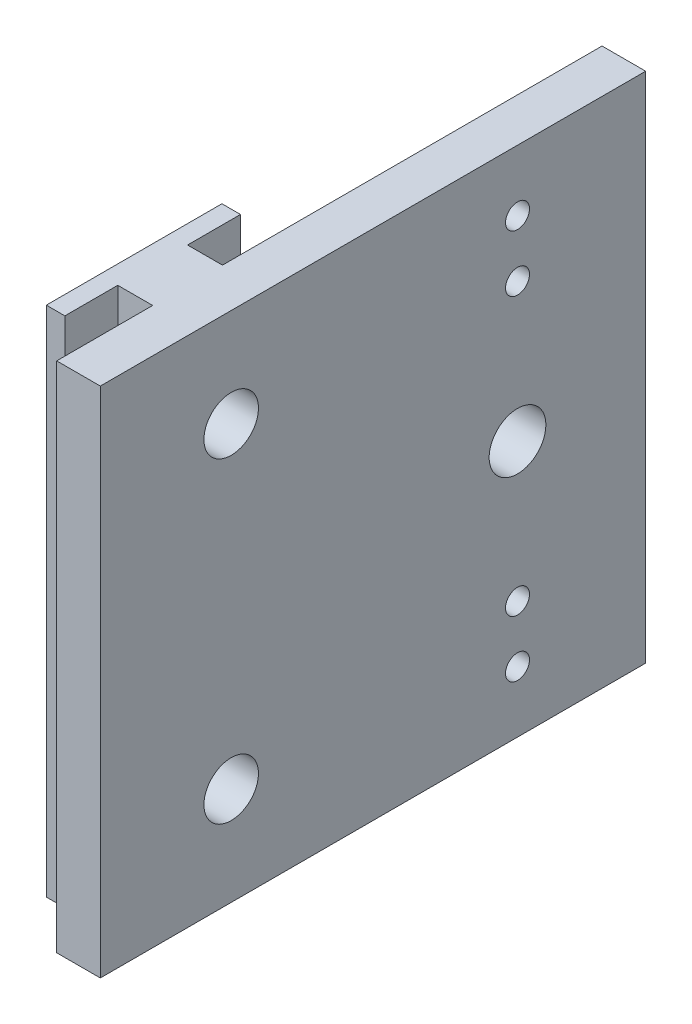
ISO-10303-21;
HEADER;
FILE_DESCRIPTION(('STEP AP214'),'2;1');
FILE_NAME('part.step','',(''),(''),'','','');
FILE_SCHEMA(('AUTOMOTIVE_DESIGN { 1 0 10303 214 1 1 1 1 }'));
ENDSEC;
DATA;
#1=APPLICATION_CONTEXT('core data for automotive mechanical design processes');
#2=APPLICATION_PROTOCOL_DEFINITION('international standard','automotive_design',2000,#1);
#3=PRODUCT_CONTEXT('',#1,'mechanical');
#4=PRODUCT('Part','Part','',(#3));
#5=PRODUCT_RELATED_PRODUCT_CATEGORY('part','',(#4));
#6=PRODUCT_DEFINITION_FORMATION('','',#4);
#7=PRODUCT_DEFINITION_CONTEXT('part definition',#1,'design');
#8=PRODUCT_DEFINITION('design','',#6,#7);
#9=PRODUCT_DEFINITION_SHAPE('','',#8);
#10=(LENGTH_UNIT() NAMED_UNIT(*) SI_UNIT(.MILLI.,.METRE.));
#11=(NAMED_UNIT(*) PLANE_ANGLE_UNIT() SI_UNIT($,.RADIAN.));
#12=(NAMED_UNIT(*) SI_UNIT($,.STERADIAN.) SOLID_ANGLE_UNIT());
#13=UNCERTAINTY_MEASURE_WITH_UNIT(LENGTH_MEASURE(1.E-05),#10,'distance_accuracy_value','');
#14=(GEOMETRIC_REPRESENTATION_CONTEXT(3) GLOBAL_UNCERTAINTY_ASSIGNED_CONTEXT((#13)) GLOBAL_UNIT_ASSIGNED_CONTEXT((#10,
#11,#12)) REPRESENTATION_CONTEXT('',''));
#15=CARTESIAN_POINT('',(0.,0.,0.));
#16=DIRECTION('',(0.,0.,1.));
#17=DIRECTION('',(1.,0.,0.));
#18=AXIS2_PLACEMENT_3D('',#15,#16,#17);
#19=CARTESIAN_POINT('',(0.,59.69,0.));
#20=DIRECTION('',(-1.,0.,0.));
#21=DIRECTION('',(0.,0.,1.));
#22=AXIS2_PLACEMENT_3D('',#19,#20,#21);
#23=PLANE('',#22);
#24=DIRECTION('',(0.,-0.499999999999999,-0.866025403784439));
#25=VECTOR('',#24,1.);
#26=CARTESIAN_POINT('',(0.,45.620354569265,-5.6515));
#27=LINE('',#26,#25);
#28=CARTESIAN_POINT('',(0.,45.620354569265,-5.6515));
#29=VERTEX_POINT('',#28);
#30=CARTESIAN_POINT('',(0.,42.9807091385301,-10.2235));
#31=VERTEX_POINT('',#30);
#32=EDGE_CURVE('E260',#29,#31,#27,.T.);
#33=ORIENTED_EDGE('',*,*,#32,.T.);
#34=DIRECTION('',(0.,0.5,-0.866025403784438));
#35=VECTOR('',#34,1.);
#36=CARTESIAN_POINT('',(0.,42.9807091385301,-10.2235));
#37=LINE('',#36,#35);
#38=CARTESIAN_POINT('',(0.,45.620354569265,-14.7955));
#39=VERTEX_POINT('',#38);
#40=EDGE_CURVE('E64',#31,#39,#37,.T.);
#41=ORIENTED_EDGE('',*,*,#40,.T.);
#42=DIRECTION('',(0.,1.,0.));
#43=VECTOR('',#42,1.);
#44=CARTESIAN_POINT('',(0.,45.620354569265,-14.7955));
#45=LINE('',#44,#43);
#46=CARTESIAN_POINT('',(0.,50.899645430735,-14.7955));
#47=VERTEX_POINT('',#46);
#48=EDGE_CURVE('E273',#39,#47,#45,.T.);
#49=ORIENTED_EDGE('',*,*,#48,.T.);
#50=DIRECTION('',(0.,0.499999999999999,0.866025403784439));
#51=VECTOR('',#50,1.);
#52=CARTESIAN_POINT('',(0.,50.899645430735,-14.7955));
#53=LINE('',#52,#51);
#54=CARTESIAN_POINT('',(0.,53.5392908614699,-10.2235));
#55=VERTEX_POINT('',#54);
#56=EDGE_CURVE('E270',#47,#55,#53,.T.);
#57=ORIENTED_EDGE('',*,*,#56,.T.);
#58=DIRECTION('',(0.,-0.499999999999999,0.866025403784439));
#59=VECTOR('',#58,1.);
#60=CARTESIAN_POINT('',(0.,53.5392908614699,-10.2235));
#61=LINE('',#60,#59);
#62=CARTESIAN_POINT('',(0.,50.899645430735,-5.6515));
#63=VERTEX_POINT('',#62);
#64=EDGE_CURVE('E267',#55,#63,#61,.T.);
#65=ORIENTED_EDGE('',*,*,#64,.T.);
#66=DIRECTION('',(0.,-1.,0.));
#67=VECTOR('',#66,1.);
#68=CARTESIAN_POINT('',(0.,50.899645430735,-5.6515));
#69=LINE('',#68,#67);
#70=EDGE_CURVE('E263',#63,#29,#69,.T.);
#71=ORIENTED_EDGE('',*,*,#70,.T.);
#72=EDGE_LOOP('',(#33,#41,#49,#57,#65,#71));
#73=FACE_BOUND('',#72,.T.);
#74=DIRECTION('',(0.,0.,-1.));
#75=VECTOR('',#74,1.);
#76=CARTESIAN_POINT('',(0.,0.,0.));
#77=LINE('',#76,#75);
#78=CARTESIAN_POINT('',(0.,0.,0.));
#79=VERTEX_POINT('',#78);
#80=CARTESIAN_POINT('',(0.,0.,-20.447));
#81=VERTEX_POINT('',#80);
#82=EDGE_CURVE('E395',#79,#81,#77,.T.);
#83=ORIENTED_EDGE('',*,*,#82,.F.);
#84=DIRECTION('',(0.,-1.,0.));
#85=VECTOR('',#84,1.);
#86=CARTESIAN_POINT('',(0.,59.69,0.));
#87=LINE('',#86,#85);
#88=CARTESIAN_POINT('',(0.,59.69,0.));
#89=VERTEX_POINT('',#88);
#90=EDGE_CURVE('E425',#89,#79,#87,.T.);
#91=ORIENTED_EDGE('',*,*,#90,.F.);
#92=DIRECTION('',(0.,0.,-1.));
#93=VECTOR('',#92,1.);
#94=CARTESIAN_POINT('',(0.,59.69,0.));
#95=LINE('',#94,#93);
#96=CARTESIAN_POINT('',(0.,59.69,-20.447));
#97=VERTEX_POINT('',#96);
#98=EDGE_CURVE('E352',#89,#97,#95,.T.);
#99=ORIENTED_EDGE('',*,*,#98,.T.);
#100=DIRECTION('',(0.,-1.,0.));
#101=VECTOR('',#100,1.);
#102=CARTESIAN_POINT('',(0.,59.69,-20.447));
#103=LINE('',#102,#101);
#104=EDGE_CURVE('E422',#97,#81,#103,.T.);
#105=ORIENTED_EDGE('',*,*,#104,.T.);
#106=EDGE_LOOP('',(#83,#91,#99,#105));
#107=FACE_BOUND('',#106,.T.);
#108=DIRECTION('',(0.,-0.5,-0.866025403784439));
#109=VECTOR('',#108,1.);
#110=CARTESIAN_POINT('',(0.,8.79035456926503,-5.6515));
#111=LINE('',#110,#109);
#112=CARTESIAN_POINT('',(0.,8.79035456926503,-5.6515));
#113=VERTEX_POINT('',#112);
#114=CARTESIAN_POINT('',(0.,6.15070913853007,-10.2235));
#115=VERTEX_POINT('',#114);
#116=EDGE_CURVE('E234',#113,#115,#111,.T.);
#117=ORIENTED_EDGE('',*,*,#116,.T.);
#118=DIRECTION('',(0.,0.5,-0.866025403784439));
#119=VECTOR('',#118,1.);
#120=CARTESIAN_POINT('',(0.,6.15070913853006,-10.2235));
#121=LINE('',#120,#119);
#122=CARTESIAN_POINT('',(0.,8.79035456926503,-14.7955));
#123=VERTEX_POINT('',#122);
#124=EDGE_CURVE('E56',#115,#123,#121,.T.);
#125=ORIENTED_EDGE('',*,*,#124,.T.);
#126=DIRECTION('',(0.,1.,0.));
#127=VECTOR('',#126,1.);
#128=CARTESIAN_POINT('',(0.,8.79035456926503,-14.7955));
#129=LINE('',#128,#127);
#130=CARTESIAN_POINT('',(0.,14.069645430735,-14.7955));
#131=VERTEX_POINT('',#130);
#132=EDGE_CURVE('E238',#123,#131,#129,.T.);
#133=ORIENTED_EDGE('',*,*,#132,.T.);
#134=DIRECTION('',(0.,0.5,0.866025403784439));
#135=VECTOR('',#134,1.);
#136=CARTESIAN_POINT('',(0.,14.069645430735,-14.7955));
#137=LINE('',#136,#135);
#138=CARTESIAN_POINT('',(0.,16.7092908614699,-10.2235));
#139=VERTEX_POINT('',#138);
#140=EDGE_CURVE('E845',#131,#139,#137,.T.);
#141=ORIENTED_EDGE('',*,*,#140,.T.);
#142=DIRECTION('',(0.,-0.5,0.866025403784439));
#143=VECTOR('',#142,1.);
#144=CARTESIAN_POINT('',(0.,16.7092908614699,-10.2235));
#145=LINE('',#144,#143);
#146=CARTESIAN_POINT('',(0.,14.069645430735,-5.6515));
#147=VERTEX_POINT('',#146);
#148=EDGE_CURVE('E842',#139,#147,#145,.T.);
#149=ORIENTED_EDGE('',*,*,#148,.T.);
#150=DIRECTION('',(0.,-1.,0.));
#151=VECTOR('',#150,1.);
#152=CARTESIAN_POINT('',(0.,14.069645430735,-5.6515));
#153=LINE('',#152,#151);
#154=EDGE_CURVE('E836',#147,#113,#153,.T.);
#155=ORIENTED_EDGE('',*,*,#154,.T.);
#156=EDGE_LOOP('',(#117,#125,#133,#141,#149,#155));
#157=FACE_BOUND('',#156,.T.);
#158=ADVANCED_FACE('F39',(#73,#107,#157),#23,.T.);
#159=CARTESIAN_POINT('',(6.223,59.69,-58.4835));
#160=DIRECTION('',(0.,0.,-1.));
#161=DIRECTION('',(-1.,0.,0.));
#162=AXIS2_PLACEMENT_3D('',#159,#160,#161);
#163=PLANE('',#162);
#164=DIRECTION('',(1.,0.,0.));
#165=VECTOR('',#164,1.);
#166=CARTESIAN_POINT('',(6.223,0.,-58.4835));
#167=LINE('',#166,#165);
#168=CARTESIAN_POINT('',(6.223,0.,-58.4835));
#169=VERTEX_POINT('',#168);
#170=CARTESIAN_POINT('',(11.303,0.,-58.4835));
#171=VERTEX_POINT('',#170);
#172=EDGE_CURVE('E324',#169,#171,#167,.T.);
#173=ORIENTED_EDGE('',*,*,#172,.F.);
#174=DIRECTION('',(0.,-1.,0.));
#175=VECTOR('',#174,1.);
#176=CARTESIAN_POINT('',(6.223,59.69,-58.4835));
#177=LINE('',#176,#175);
#178=CARTESIAN_POINT('',(6.223,59.69,-58.4835));
#179=VERTEX_POINT('',#178);
#180=EDGE_CURVE('E11',#179,#169,#177,.T.);
#181=ORIENTED_EDGE('',*,*,#180,.F.);
#182=DIRECTION('',(1.,0.,0.));
#183=VECTOR('',#182,1.);
#184=CARTESIAN_POINT('',(6.223,59.69,-58.4835));
#185=LINE('',#184,#183);
#186=CARTESIAN_POINT('',(11.303,59.69,-58.4835));
#187=VERTEX_POINT('',#186);
#188=EDGE_CURVE('E325',#179,#187,#185,.T.);
#189=ORIENTED_EDGE('',*,*,#188,.T.);
#190=DIRECTION('',(0.,-1.,0.));
#191=VECTOR('',#190,1.);
#192=CARTESIAN_POINT('',(11.303,59.69,-58.4835));
#193=LINE('',#192,#191);
#194=EDGE_CURVE('E368',#187,#171,#193,.T.);
#195=ORIENTED_EDGE('',*,*,#194,.T.);
#196=EDGE_LOOP('',(#173,#181,#189,#195));
#197=FACE_BOUND('',#196,.T.);
#198=ADVANCED_FACE('F41',(#197),#163,.T.);
#199=CARTESIAN_POINT('',(6.223,59.69,-14.2875));
#200=DIRECTION('',(-1.,0.,0.));
#201=DIRECTION('',(0.,0.,1.));
#202=AXIS2_PLACEMENT_3D('',#199,#200,#201);
#203=PLANE('',#202);
#204=CARTESIAN_POINT('',(6.223,52.578,-43.561));
#205=DIRECTION('',(-1.,0.,0.));
#206=DIRECTION('',(0.,0.,1.));
#207=AXIS2_PLACEMENT_3D('',#204,#205,#206);
#208=CIRCLE('',#207,1.39700000000001);
#209=CARTESIAN_POINT('',(6.223,52.578,-42.164));
#210=VERTEX_POINT('',#209);
#211=EDGE_CURVE('E321',#210,#210,#208,.T.);
#212=ORIENTED_EDGE('',*,*,#211,.F.);
#213=EDGE_LOOP('',(#212));
#214=FACE_BOUND('',#213,.T.);
#215=CARTESIAN_POINT('',(6.223,45.974,-43.561));
#216=DIRECTION('',(-1.,0.,0.));
#217=DIRECTION('',(0.,0.,1.));
#218=AXIS2_PLACEMENT_3D('',#215,#216,#217);
#219=CIRCLE('',#218,1.397);
#220=CARTESIAN_POINT('',(6.223,45.974,-42.164));
#221=VERTEX_POINT('',#220);
#222=EDGE_CURVE('E318',#221,#221,#219,.T.);
#223=ORIENTED_EDGE('',*,*,#222,.F.);
#224=EDGE_LOOP('',(#223));
#225=FACE_BOUND('',#224,.T.);
#226=CARTESIAN_POINT('',(6.223,7.112,-43.561));
#227=DIRECTION('',(-1.,0.,0.));
#228=DIRECTION('',(0.,0.,1.));
#229=AXIS2_PLACEMENT_3D('',#226,#227,#228);
#230=CIRCLE('',#229,1.397);
#231=CARTESIAN_POINT('',(6.223,7.112,-42.164));
#232=VERTEX_POINT('',#231);
#233=EDGE_CURVE('E315',#232,#232,#230,.T.);
#234=ORIENTED_EDGE('',*,*,#233,.F.);
#235=EDGE_LOOP('',(#234));
#236=FACE_BOUND('',#235,.T.);
#237=CARTESIAN_POINT('',(6.223,29.845,-43.561));
#238=DIRECTION('',(-1.,0.,0.));
#239=DIRECTION('',(0.,0.,1.));
#240=AXIS2_PLACEMENT_3D('',#237,#238,#239);
#241=CIRCLE('',#240,3.302);
#242=CARTESIAN_POINT('',(6.223,29.845,-40.259));
#243=VERTEX_POINT('',#242);
#244=EDGE_CURVE('E312',#243,#243,#241,.T.);
#245=ORIENTED_EDGE('',*,*,#244,.F.);
#246=EDGE_LOOP('',(#245));
#247=FACE_BOUND('',#246,.T.);
#248=CARTESIAN_POINT('',(6.223,13.716,-43.561));
#249=DIRECTION('',(-1.,0.,0.));
#250=DIRECTION('',(0.,0.,1.));
#251=AXIS2_PLACEMENT_3D('',#248,#249,#250);
#252=CIRCLE('',#251,1.397);
#253=CARTESIAN_POINT('',(6.223,13.716,-42.164));
#254=VERTEX_POINT('',#253);
#255=EDGE_CURVE('E309',#254,#254,#252,.T.);
#256=ORIENTED_EDGE('',*,*,#255,.F.);
#257=EDGE_LOOP('',(#256));
#258=FACE_BOUND('',#257,.T.);
#259=DIRECTION('',(0.,0.,-1.));
#260=VECTOR('',#259,1.);
#261=CARTESIAN_POINT('',(6.223,0.,-14.2875));
#262=LINE('',#261,#260);
#263=CARTESIAN_POINT('',(6.223,0.,-14.2875));
#264=VERTEX_POINT('',#263);
#265=EDGE_CURVE('E329',#264,#169,#262,.T.);
#266=ORIENTED_EDGE('',*,*,#265,.F.);
#267=DIRECTION('',(0.,-1.,0.));
#268=VECTOR('',#267,1.);
#269=CARTESIAN_POINT('',(6.223,59.69,-14.2875));
#270=LINE('',#269,#268);
#271=CARTESIAN_POINT('',(6.223,59.69,-14.2875));
#272=VERTEX_POINT('',#271);
#273=EDGE_CURVE('E48',#272,#264,#270,.T.);
#274=ORIENTED_EDGE('',*,*,#273,.F.);
#275=DIRECTION('',(0.,0.,-1.));
#276=VECTOR('',#275,1.);
#277=CARTESIAN_POINT('',(6.223,59.69,-14.2875));
#278=LINE('',#277,#276);
#279=EDGE_CURVE('E365',#272,#179,#278,.T.);
#280=ORIENTED_EDGE('',*,*,#279,.T.);
#281=ORIENTED_EDGE('',*,*,#180,.T.);
#282=EDGE_LOOP('',(#266,#274,#280,#281));
#283=FACE_BOUND('',#282,.T.);
#284=ADVANCED_FACE('F456',(#214,#225,#236,#247,#258,#283),#203,.T.);
#285=CARTESIAN_POINT('',(2.159,59.69,-14.2875));
#286=DIRECTION('',(0.,0.,-1.));
#287=DIRECTION('',(-1.,0.,0.));
#288=AXIS2_PLACEMENT_3D('',#285,#286,#287);
#289=PLANE('',#288);
#290=DIRECTION('',(1.,0.,0.));
#291=VECTOR('',#290,1.);
#292=CARTESIAN_POINT('',(2.159,0.,-14.2875));
#293=LINE('',#292,#291);
#294=CARTESIAN_POINT('',(2.159,0.,-14.2875));
#295=VERTEX_POINT('',#294);
#296=EDGE_CURVE('E407',#295,#264,#293,.T.);
#297=ORIENTED_EDGE('',*,*,#296,.F.);
#298=DIRECTION('',(0.,-1.,0.));
#299=VECTOR('',#298,1.);
#300=CARTESIAN_POINT('',(2.159,59.69,-14.2875));
#301=LINE('',#300,#299);
#302=CARTESIAN_POINT('',(2.159,59.69,-14.2875));
#303=VERTEX_POINT('',#302);
#304=EDGE_CURVE('E416',#303,#295,#301,.T.);
#305=ORIENTED_EDGE('',*,*,#304,.F.);
#306=DIRECTION('',(1.,0.,0.));
#307=VECTOR('',#306,1.);
#308=CARTESIAN_POINT('',(2.159,59.69,-14.2875));
#309=LINE('',#308,#307);
#310=EDGE_CURVE('E362',#303,#272,#309,.T.);
#311=ORIENTED_EDGE('',*,*,#310,.T.);
#312=ORIENTED_EDGE('',*,*,#273,.T.);
#313=EDGE_LOOP('',(#297,#305,#311,#312));
#314=FACE_BOUND('',#313,.T.);
#315=ADVANCED_FACE('F493',(#314),#289,.T.);
#316=CARTESIAN_POINT('',(2.159,59.69,-20.447));
#317=DIRECTION('',(1.,0.,0.));
#318=DIRECTION('',(0.,0.,-1.));
#319=AXIS2_PLACEMENT_3D('',#316,#317,#318);
#320=PLANE('',#319);
#321=DIRECTION('',(0.,0.,1.));
#322=VECTOR('',#321,1.);
#323=CARTESIAN_POINT('',(2.159,0.,-20.447));
#324=LINE('',#323,#322);
#325=CARTESIAN_POINT('',(2.159,0.,-20.447));
#326=VERTEX_POINT('',#325);
#327=EDGE_CURVE('E403',#326,#295,#324,.T.);
#328=ORIENTED_EDGE('',*,*,#327,.F.);
#329=DIRECTION('',(0.,-1.,0.));
#330=VECTOR('',#329,1.);
#331=CARTESIAN_POINT('',(2.159,59.69,-20.447));
#332=LINE('',#331,#330);
#333=CARTESIAN_POINT('',(2.159,59.69,-20.447));
#334=VERTEX_POINT('',#333);
#335=EDGE_CURVE('E419',#334,#326,#332,.T.);
#336=ORIENTED_EDGE('',*,*,#335,.F.);
#337=DIRECTION('',(0.,0.,1.));
#338=VECTOR('',#337,1.);
#339=CARTESIAN_POINT('',(2.159,59.69,-20.447));
#340=LINE('',#339,#338);
#341=EDGE_CURVE('E359',#334,#303,#340,.T.);
#342=ORIENTED_EDGE('',*,*,#341,.T.);
#343=ORIENTED_EDGE('',*,*,#304,.T.);
#344=EDGE_LOOP('',(#328,#336,#342,#343));
#345=FACE_BOUND('',#344,.T.);
#346=ADVANCED_FACE('F490',(#345),#320,.T.);
#347=CARTESIAN_POINT('',(0.,59.69,-20.447));
#348=DIRECTION('',(0.,0.,-1.));
#349=DIRECTION('',(-1.,0.,0.));
#350=AXIS2_PLACEMENT_3D('',#347,#348,#349);
#351=PLANE('',#350);
#352=DIRECTION('',(1.,0.,0.));
#353=VECTOR('',#352,1.);
#354=CARTESIAN_POINT('',(0.,0.,-20.447));
#355=LINE('',#354,#353);
#356=EDGE_CURVE('E399',#81,#326,#355,.T.);
#357=ORIENTED_EDGE('',*,*,#356,.F.);
#358=ORIENTED_EDGE('',*,*,#104,.F.);
#359=DIRECTION('',(1.,0.,0.));
#360=VECTOR('',#359,1.);
#361=CARTESIAN_POINT('',(0.,59.69,-20.447));
#362=LINE('',#361,#360);
#363=EDGE_CURVE('E356',#97,#334,#362,.T.);
#364=ORIENTED_EDGE('',*,*,#363,.T.);
#365=ORIENTED_EDGE('',*,*,#335,.T.);
#366=EDGE_LOOP('',(#357,#358,#364,#365));
#367=FACE_BOUND('',#366,.T.);
#368=ADVANCED_FACE('F487',(#367),#351,.T.);
#369=CARTESIAN_POINT('',(2.159,59.69,0.));
#370=DIRECTION('',(0.,0.,1.));
#371=DIRECTION('',(1.,0.,0.));
#372=AXIS2_PLACEMENT_3D('',#369,#370,#371);
#373=PLANE('',#372);
#374=DIRECTION('',(-1.,0.,0.));
#375=VECTOR('',#374,1.);
#376=CARTESIAN_POINT('',(2.159,0.,0.));
#377=LINE('',#376,#375);
#378=CARTESIAN_POINT('',(2.159,0.,0.));
#379=VERTEX_POINT('',#378);
#380=EDGE_CURVE('E391',#379,#79,#377,.T.);
#381=ORIENTED_EDGE('',*,*,#380,.F.);
#382=DIRECTION('',(0.,-1.,0.));
#383=VECTOR('',#382,1.);
#384=CARTESIAN_POINT('',(2.159,59.69,0.));
#385=LINE('',#384,#383);
#386=CARTESIAN_POINT('',(2.159,59.69,0.));
#387=VERTEX_POINT('',#386);
#388=EDGE_CURVE('E428',#387,#379,#385,.T.);
#389=ORIENTED_EDGE('',*,*,#388,.F.);
#390=DIRECTION('',(-1.,0.,0.));
#391=VECTOR('',#390,1.);
#392=CARTESIAN_POINT('',(2.159,59.69,0.));
#393=LINE('',#392,#391);
#394=EDGE_CURVE('E348',#387,#89,#393,.T.);
#395=ORIENTED_EDGE('',*,*,#394,.T.);
#396=ORIENTED_EDGE('',*,*,#90,.T.);
#397=EDGE_LOOP('',(#381,#389,#395,#396));
#398=FACE_BOUND('',#397,.T.);
#399=ADVANCED_FACE('F479',(#398),#373,.T.);
#400=CARTESIAN_POINT('',(2.159,59.69,-6.1595));
#401=DIRECTION('',(1.,0.,0.));
#402=DIRECTION('',(0.,0.,-1.));
#403=AXIS2_PLACEMENT_3D('',#400,#401,#402);
#404=PLANE('',#403);
#405=DIRECTION('',(0.,0.,1.));
#406=VECTOR('',#405,1.);
#407=CARTESIAN_POINT('',(2.159,0.,-6.1595));
#408=LINE('',#407,#406);
#409=CARTESIAN_POINT('',(2.159,0.,-6.1595));
#410=VERTEX_POINT('',#409);
#411=EDGE_CURVE('E387',#410,#379,#408,.T.);
#412=ORIENTED_EDGE('',*,*,#411,.F.);
#413=DIRECTION('',(0.,-1.,0.));
#414=VECTOR('',#413,1.);
#415=CARTESIAN_POINT('',(2.159,59.69,-6.1595));
#416=LINE('',#415,#414);
#417=CARTESIAN_POINT('',(2.159,59.69,-6.1595));
#418=VERTEX_POINT('',#417);
#419=EDGE_CURVE('E431',#418,#410,#416,.T.);
#420=ORIENTED_EDGE('',*,*,#419,.F.);
#421=DIRECTION('',(0.,0.,1.));
#422=VECTOR('',#421,1.);
#423=CARTESIAN_POINT('',(2.159,59.69,-6.1595));
#424=LINE('',#423,#422);
#425=EDGE_CURVE('E344',#418,#387,#424,.T.);
#426=ORIENTED_EDGE('',*,*,#425,.T.);
#427=ORIENTED_EDGE('',*,*,#388,.T.);
#428=EDGE_LOOP('',(#412,#420,#426,#427));
#429=FACE_BOUND('',#428,.T.);
#430=ADVANCED_FACE('F475',(#429),#404,.T.);
#431=CARTESIAN_POINT('',(6.223,59.69,-6.1595));
#432=DIRECTION('',(0.,0.,1.));
#433=DIRECTION('',(1.,0.,0.));
#434=AXIS2_PLACEMENT_3D('',#431,#432,#433);
#435=PLANE('',#434);
#436=DIRECTION('',(-1.,0.,0.));
#437=VECTOR('',#436,1.);
#438=CARTESIAN_POINT('',(6.223,0.,-6.1595));
#439=LINE('',#438,#437);
#440=CARTESIAN_POINT('',(6.223,0.,-6.1595));
#441=VERTEX_POINT('',#440);
#442=EDGE_CURVE('E383',#441,#410,#439,.T.);
#443=ORIENTED_EDGE('',*,*,#442,.F.);
#444=DIRECTION('',(0.,-1.,0.));
#445=VECTOR('',#444,1.);
#446=CARTESIAN_POINT('',(6.223,59.69,-6.1595));
#447=LINE('',#446,#445);
#448=CARTESIAN_POINT('',(6.223,59.69,-6.1595));
#449=VERTEX_POINT('',#448);
#450=EDGE_CURVE('E434',#449,#441,#447,.T.);
#451=ORIENTED_EDGE('',*,*,#450,.F.);
#452=DIRECTION('',(-1.,0.,0.));
#453=VECTOR('',#452,1.);
#454=CARTESIAN_POINT('',(6.223,59.69,-6.1595));
#455=LINE('',#454,#453);
#456=EDGE_CURVE('E340',#449,#418,#455,.T.);
#457=ORIENTED_EDGE('',*,*,#456,.T.);
#458=ORIENTED_EDGE('',*,*,#419,.T.);
#459=EDGE_LOOP('',(#443,#451,#457,#458));
#460=FACE_BOUND('',#459,.T.);
#461=ADVANCED_FACE('F471',(#460),#435,.T.);
#462=CARTESIAN_POINT('',(6.223,59.69,5.01650000000001));
#463=DIRECTION('',(-1.,0.,0.));
#464=DIRECTION('',(0.,0.,1.));
#465=AXIS2_PLACEMENT_3D('',#462,#463,#464);
#466=PLANE('',#465);
#467=DIRECTION('',(0.,0.,-1.));
#468=VECTOR('',#467,1.);
#469=CARTESIAN_POINT('',(6.223,0.,5.01650000000001));
#470=LINE('',#469,#468);
#471=CARTESIAN_POINT('',(6.223,0.,5.01650000000001));
#472=VERTEX_POINT('',#471);
#473=EDGE_CURVE('E379',#472,#441,#470,.T.);
#474=ORIENTED_EDGE('',*,*,#473,.F.);
#475=DIRECTION('',(0.,-1.,0.));
#476=VECTOR('',#475,1.);
#477=CARTESIAN_POINT('',(6.223,59.69,5.01650000000001));
#478=LINE('',#477,#476);
#479=CARTESIAN_POINT('',(6.223,59.69,5.01650000000001));
#480=VERTEX_POINT('',#479);
#481=EDGE_CURVE('E437',#480,#472,#478,.T.);
#482=ORIENTED_EDGE('',*,*,#481,.F.);
#483=DIRECTION('',(0.,0.,-1.));
#484=VECTOR('',#483,1.);
#485=CARTESIAN_POINT('',(6.223,59.69,5.01650000000001));
#486=LINE('',#485,#484);
#487=EDGE_CURVE('E336',#480,#449,#486,.T.);
#488=ORIENTED_EDGE('',*,*,#487,.T.);
#489=ORIENTED_EDGE('',*,*,#450,.T.);
#490=EDGE_LOOP('',(#474,#482,#488,#489));
#491=FACE_BOUND('',#490,.T.);
#492=ADVANCED_FACE('F469',(#491),#466,.T.);
#493=CARTESIAN_POINT('',(11.303,59.69,5.01650000000001));
#494=DIRECTION('',(0.,0.,1.));
#495=DIRECTION('',(1.,0.,0.));
#496=AXIS2_PLACEMENT_3D('',#493,#494,#495);
#497=PLANE('',#496);
#498=DIRECTION('',(-1.,0.,0.));
#499=VECTOR('',#498,1.);
#500=CARTESIAN_POINT('',(11.303,0.,5.01650000000001));
#501=LINE('',#500,#499);
#502=CARTESIAN_POINT('',(11.303,0.,5.01650000000001));
#503=VERTEX_POINT('',#502);
#504=EDGE_CURVE('E375',#503,#472,#501,.T.);
#505=ORIENTED_EDGE('',*,*,#504,.F.);
#506=DIRECTION('',(0.,-1.,0.));
#507=VECTOR('',#506,1.);
#508=CARTESIAN_POINT('',(11.303,59.69,5.01650000000001));
#509=LINE('',#508,#507);
#510=CARTESIAN_POINT('',(11.303,59.69,5.01650000000001));
#511=VERTEX_POINT('',#510);
#512=EDGE_CURVE('E440',#511,#503,#509,.T.);
#513=ORIENTED_EDGE('',*,*,#512,.F.);
#514=DIRECTION('',(-1.,0.,0.));
#515=VECTOR('',#514,1.);
#516=CARTESIAN_POINT('',(11.303,59.69,5.01650000000001));
#517=LINE('',#516,#515);
#518=EDGE_CURVE('E332',#511,#480,#517,.T.);
#519=ORIENTED_EDGE('',*,*,#518,.T.);
#520=ORIENTED_EDGE('',*,*,#481,.T.);
#521=EDGE_LOOP('',(#505,#513,#519,#520));
#522=FACE_BOUND('',#521,.T.);
#523=ADVANCED_FACE('F465',(#522),#497,.T.);
#524=CARTESIAN_POINT('',(11.303,59.69,-58.4835));
#525=DIRECTION('',(1.,0.,0.));
#526=DIRECTION('',(0.,0.,-1.));
#527=AXIS2_PLACEMENT_3D('',#524,#525,#526);
#528=PLANE('',#527);
#529=CARTESIAN_POINT('',(11.303,48.26,-10.2235));
#530=DIRECTION('',(-1.,0.,0.));
#531=DIRECTION('',(0.,0.,1.));
#532=AXIS2_PLACEMENT_3D('',#529,#530,#531);
#533=CIRCLE('',#532,3.175);
#534=CARTESIAN_POINT('',(11.303,48.26,-7.0485));
#535=VERTEX_POINT('',#534);
#536=EDGE_CURVE('E288',#535,#535,#533,.T.);
#537=ORIENTED_EDGE('',*,*,#536,.T.);
#538=EDGE_LOOP('',(#537));
#539=FACE_BOUND('',#538,.T.);
#540=CARTESIAN_POINT('',(11.303,11.43,-10.2235));
#541=DIRECTION('',(-1.,0.,0.));
#542=DIRECTION('',(0.,0.,1.));
#543=AXIS2_PLACEMENT_3D('',#540,#541,#542);
#544=CIRCLE('',#543,3.175);
#545=CARTESIAN_POINT('',(11.303,11.43,-7.0485));
#546=VERTEX_POINT('',#545);
#547=EDGE_CURVE('E292',#546,#546,#544,.T.);
#548=ORIENTED_EDGE('',*,*,#547,.T.);
#549=EDGE_LOOP('',(#548));
#550=FACE_BOUND('',#549,.T.);
#551=CARTESIAN_POINT('',(11.303,52.578,-43.561));
#552=DIRECTION('',(1.,0.,0.));
#553=DIRECTION('',(0.,0.,-1.));
#554=AXIS2_PLACEMENT_3D('',#551,#552,#553);
#555=CIRCLE('',#554,1.39700000000001);
#556=CARTESIAN_POINT('',(11.303,52.578,-44.958));
#557=VERTEX_POINT('',#556);
#558=EDGE_CURVE('E291',#557,#557,#555,.T.);
#559=ORIENTED_EDGE('',*,*,#558,.F.);
#560=EDGE_LOOP('',(#559));
#561=FACE_BOUND('',#560,.T.);
#562=CARTESIAN_POINT('',(11.303,45.974,-43.561));
#563=DIRECTION('',(1.,0.,0.));
#564=DIRECTION('',(0.,0.,-1.));
#565=AXIS2_PLACEMENT_3D('',#562,#563,#564);
#566=CIRCLE('',#565,1.397);
#567=CARTESIAN_POINT('',(11.303,45.974,-44.958));
#568=VERTEX_POINT('',#567);
#569=EDGE_CURVE('E302',#568,#568,#566,.T.);
#570=ORIENTED_EDGE('',*,*,#569,.F.);
#571=EDGE_LOOP('',(#570));
#572=FACE_BOUND('',#571,.T.);
#573=CARTESIAN_POINT('',(11.303,7.112,-43.561));
#574=DIRECTION('',(1.,0.,0.));
#575=DIRECTION('',(0.,0.,-1.));
#576=AXIS2_PLACEMENT_3D('',#573,#574,#575);
#577=CIRCLE('',#576,1.397);
#578=CARTESIAN_POINT('',(11.303,7.112,-44.958));
#579=VERTEX_POINT('',#578);
#580=EDGE_CURVE('E299',#579,#579,#577,.T.);
#581=ORIENTED_EDGE('',*,*,#580,.F.);
#582=EDGE_LOOP('',(#581));
#583=FACE_BOUND('',#582,.T.);
#584=CARTESIAN_POINT('',(11.303,29.845,-43.561));
#585=DIRECTION('',(1.,0.,0.));
#586=DIRECTION('',(0.,0.,-1.));
#587=AXIS2_PLACEMENT_3D('',#584,#585,#586);
#588=CIRCLE('',#587,3.302);
#589=CARTESIAN_POINT('',(11.303,29.845,-46.863));
#590=VERTEX_POINT('',#589);
#591=EDGE_CURVE('E295',#590,#590,#588,.T.);
#592=ORIENTED_EDGE('',*,*,#591,.F.);
#593=EDGE_LOOP('',(#592));
#594=FACE_BOUND('',#593,.T.);
#595=CARTESIAN_POINT('',(11.303,13.716,-43.561));
#596=DIRECTION('',(1.,0.,0.));
#597=DIRECTION('',(0.,0.,-1.));
#598=AXIS2_PLACEMENT_3D('',#595,#596,#597);
#599=CIRCLE('',#598,1.397);
#600=CARTESIAN_POINT('',(11.303,13.716,-44.958));
#601=VERTEX_POINT('',#600);
#602=EDGE_CURVE('E298',#601,#601,#599,.T.);
#603=ORIENTED_EDGE('',*,*,#602,.F.);
#604=EDGE_LOOP('',(#603));
#605=FACE_BOUND('',#604,.T.);
#606=DIRECTION('',(0.,0.,1.));
#607=VECTOR('',#606,1.);
#608=CARTESIAN_POINT('',(11.303,0.,-58.4835));
#609=LINE('',#608,#607);
#610=EDGE_CURVE('E371',#171,#503,#609,.T.);
#611=ORIENTED_EDGE('',*,*,#610,.F.);
#612=ORIENTED_EDGE('',*,*,#194,.F.);
#613=DIRECTION('',(0.,0.,1.));
#614=VECTOR('',#613,1.);
#615=CARTESIAN_POINT('',(11.303,59.69,-58.4835));
#616=LINE('',#615,#614);
#617=EDGE_CURVE('E328',#187,#511,#616,.T.);
#618=ORIENTED_EDGE('',*,*,#617,.T.);
#619=ORIENTED_EDGE('',*,*,#512,.T.);
#620=EDGE_LOOP('',(#611,#612,#618,#619));
#621=FACE_BOUND('',#620,.T.);
#622=ADVANCED_FACE('F449',(#539,#550,#561,#572,#583,#594,#605,#621),#528,.T.);
#623=CARTESIAN_POINT('',(0.,59.69,0.));
#624=DIRECTION('',(0.,-1.,0.));
#625=DIRECTION('',(0.,0.,-1.));
#626=AXIS2_PLACEMENT_3D('',#623,#624,#625);
#627=PLANE('',#626);
#628=ORIENTED_EDGE('',*,*,#188,.F.);
#629=ORIENTED_EDGE('',*,*,#279,.F.);
#630=ORIENTED_EDGE('',*,*,#310,.F.);
#631=ORIENTED_EDGE('',*,*,#341,.F.);
#632=ORIENTED_EDGE('',*,*,#363,.F.);
#633=ORIENTED_EDGE('',*,*,#98,.F.);
#634=ORIENTED_EDGE('',*,*,#394,.F.);
#635=ORIENTED_EDGE('',*,*,#425,.F.);
#636=ORIENTED_EDGE('',*,*,#456,.F.);
#637=ORIENTED_EDGE('',*,*,#487,.F.);
#638=ORIENTED_EDGE('',*,*,#518,.F.);
#639=ORIENTED_EDGE('',*,*,#617,.F.);
#640=EDGE_LOOP('',(#628,#629,#630,#631,#632,#633,#634,#635,#636,#637,#638,#639));
#641=FACE_BOUND('',#640,.T.);
#642=ADVANCED_FACE('F459',(#641),#627,.F.);
#643=CARTESIAN_POINT('',(0.,0.,0.));
#644=DIRECTION('',(0.,-1.,0.));
#645=DIRECTION('',(0.,0.,-1.));
#646=AXIS2_PLACEMENT_3D('',#643,#644,#645);
#647=PLANE('',#646);
#648=ORIENTED_EDGE('',*,*,#172,.T.);
#649=ORIENTED_EDGE('',*,*,#610,.T.);
#650=ORIENTED_EDGE('',*,*,#504,.T.);
#651=ORIENTED_EDGE('',*,*,#473,.T.);
#652=ORIENTED_EDGE('',*,*,#442,.T.);
#653=ORIENTED_EDGE('',*,*,#411,.T.);
#654=ORIENTED_EDGE('',*,*,#380,.T.);
#655=ORIENTED_EDGE('',*,*,#82,.T.);
#656=ORIENTED_EDGE('',*,*,#356,.T.);
#657=ORIENTED_EDGE('',*,*,#327,.T.);
#658=ORIENTED_EDGE('',*,*,#296,.T.);
#659=ORIENTED_EDGE('',*,*,#265,.T.);
#660=EDGE_LOOP('',(#648,#649,#650,#651,#652,#653,#654,#655,#656,#657,#658,#659));
#661=FACE_BOUND('',#660,.T.);
#662=ADVANCED_FACE('F452',(#661),#647,.T.);
#663=CARTESIAN_POINT('',(0.,13.716,-43.561));
#664=DIRECTION('',(1.,0.,0.));
#665=DIRECTION('',(0.,0.,-1.));
#666=AXIS2_PLACEMENT_3D('',#663,#664,#665);
#667=CYLINDRICAL_SURFACE('',#666,1.397);
#668=ORIENTED_EDGE('',*,*,#255,.T.);
#669=EDGE_LOOP('',(#668));
#670=FACE_BOUND('',#669,.T.);
#671=ORIENTED_EDGE('',*,*,#602,.T.);
#672=EDGE_LOOP('',(#671));
#673=FACE_BOUND('',#672,.T.);
#674=ADVANCED_FACE('F542',(#670,#673),#667,.F.);
#675=CARTESIAN_POINT('',(0.,29.845,-43.561));
#676=DIRECTION('',(1.,0.,0.));
#677=DIRECTION('',(0.,0.,-1.));
#678=AXIS2_PLACEMENT_3D('',#675,#676,#677);
#679=CYLINDRICAL_SURFACE('',#678,3.302);
#680=ORIENTED_EDGE('',*,*,#244,.T.);
#681=EDGE_LOOP('',(#680));
#682=FACE_BOUND('',#681,.T.);
#683=ORIENTED_EDGE('',*,*,#591,.T.);
#684=EDGE_LOOP('',(#683));
#685=FACE_BOUND('',#684,.T.);
#686=ADVANCED_FACE('F544',(#682,#685),#679,.F.);
#687=CARTESIAN_POINT('',(0.,7.112,-43.561));
#688=DIRECTION('',(1.,0.,0.));
#689=DIRECTION('',(0.,0.,-1.));
#690=AXIS2_PLACEMENT_3D('',#687,#688,#689);
#691=CYLINDRICAL_SURFACE('',#690,1.397);
#692=ORIENTED_EDGE('',*,*,#233,.T.);
#693=EDGE_LOOP('',(#692));
#694=FACE_BOUND('',#693,.T.);
#695=ORIENTED_EDGE('',*,*,#580,.T.);
#696=EDGE_LOOP('',(#695));
#697=FACE_BOUND('',#696,.T.);
#698=ADVANCED_FACE('F551',(#694,#697),#691,.F.);
#699=CARTESIAN_POINT('',(0.,45.974,-43.561));
#700=DIRECTION('',(1.,0.,0.));
#701=DIRECTION('',(0.,0.,-1.));
#702=AXIS2_PLACEMENT_3D('',#699,#700,#701);
#703=CYLINDRICAL_SURFACE('',#702,1.397);
#704=ORIENTED_EDGE('',*,*,#222,.T.);
#705=EDGE_LOOP('',(#704));
#706=FACE_BOUND('',#705,.T.);
#707=ORIENTED_EDGE('',*,*,#569,.T.);
#708=EDGE_LOOP('',(#707));
#709=FACE_BOUND('',#708,.T.);
#710=ADVANCED_FACE('F560',(#706,#709),#703,.F.);
#711=CARTESIAN_POINT('',(0.,52.578,-43.561));
#712=DIRECTION('',(1.,0.,0.));
#713=DIRECTION('',(0.,0.,-1.));
#714=AXIS2_PLACEMENT_3D('',#711,#712,#713);
#715=CYLINDRICAL_SURFACE('',#714,1.39700000000001);
#716=ORIENTED_EDGE('',*,*,#211,.T.);
#717=EDGE_LOOP('',(#716));
#718=FACE_BOUND('',#717,.T.);
#719=ORIENTED_EDGE('',*,*,#558,.T.);
#720=EDGE_LOOP('',(#719));
#721=FACE_BOUND('',#720,.T.);
#722=ADVANCED_FACE('F556',(#718,#721),#715,.F.);
#723=CARTESIAN_POINT('',(11.303,11.43,-10.2235));
#724=DIRECTION('',(-1.,0.,0.));
#725=DIRECTION('',(0.,0.,1.));
#726=AXIS2_PLACEMENT_3D('',#723,#724,#725);
#727=CYLINDRICAL_SURFACE('',#726,3.175);
#728=CARTESIAN_POINT('',(2.06375,11.43,-10.2235));
#729=DIRECTION('',(1.,0.,0.));
#730=DIRECTION('',(0.,0.,-1.));
#731=AXIS2_PLACEMENT_3D('',#728,#729,#730);
#732=CIRCLE('',#731,3.175);
#733=CARTESIAN_POINT('',(2.06375,11.43,-13.3985));
#734=VERTEX_POINT('',#733);
#735=EDGE_CURVE('E43',#734,#734,#732,.F.);
#736=ORIENTED_EDGE('',*,*,#735,.T.);
#737=EDGE_LOOP('',(#736));
#738=FACE_BOUND('',#737,.T.);
#739=ORIENTED_EDGE('',*,*,#547,.F.);
#740=EDGE_LOOP('',(#739));
#741=FACE_BOUND('',#740,.T.);
#742=ADVANCED_FACE('F559',(#738,#741),#727,.F.);
#743=CARTESIAN_POINT('',(11.303,48.26,-10.2235));
#744=DIRECTION('',(-1.,0.,0.));
#745=DIRECTION('',(0.,0.,1.));
#746=AXIS2_PLACEMENT_3D('',#743,#744,#745);
#747=CYLINDRICAL_SURFACE('',#746,3.175);
#748=CARTESIAN_POINT('',(2.06375,48.26,-10.2235));
#749=DIRECTION('',(1.,0.,0.));
#750=DIRECTION('',(0.,0.,-1.));
#751=AXIS2_PLACEMENT_3D('',#748,#749,#750);
#752=CIRCLE('',#751,3.175);
#753=CARTESIAN_POINT('',(2.06375,48.26,-13.3985));
#754=VERTEX_POINT('',#753);
#755=EDGE_CURVE('E239',#754,#754,#752,.F.);
#756=ORIENTED_EDGE('',*,*,#755,.T.);
#757=EDGE_LOOP('',(#756));
#758=FACE_BOUND('',#757,.T.);
#759=ORIENTED_EDGE('',*,*,#536,.F.);
#760=EDGE_LOOP('',(#759));
#761=FACE_BOUND('',#760,.T.);
#762=ADVANCED_FACE('F569',(#758,#761),#747,.F.);
#763=CARTESIAN_POINT('',(2.06375,0.,0.));
#764=DIRECTION('',(1.,0.,0.));
#765=DIRECTION('',(0.,0.,-1.));
#766=AXIS2_PLACEMENT_3D('',#763,#764,#765);
#767=PLANE('',#766);
#768=DIRECTION('',(0.,0.5,-0.866025403784438));
#769=VECTOR('',#768,1.);
#770=CARTESIAN_POINT('',(2.06375,42.9807091385301,-10.2235));
#771=LINE('',#770,#769);
#772=CARTESIAN_POINT('',(2.06375,42.9807091385301,-10.2235));
#773=VERTEX_POINT('',#772);
#774=CARTESIAN_POINT('',(2.06375,45.620354569265,-14.7955));
#775=VERTEX_POINT('',#774);
#776=EDGE_CURVE('E264',#773,#775,#771,.T.);
#777=ORIENTED_EDGE('',*,*,#776,.F.);
#778=DIRECTION('',(0.,-0.499999999999999,-0.866025403784439));
#779=VECTOR('',#778,1.);
#780=CARTESIAN_POINT('',(2.06375,45.620354569265,-5.6515));
#781=LINE('',#780,#779);
#782=CARTESIAN_POINT('',(2.06375,45.620354569265,-5.6515));
#783=VERTEX_POINT('',#782);
#784=EDGE_CURVE('E259',#783,#773,#781,.T.);
#785=ORIENTED_EDGE('',*,*,#784,.F.);
#786=DIRECTION('',(0.,-1.,0.));
#787=VECTOR('',#786,1.);
#788=CARTESIAN_POINT('',(2.06375,50.899645430735,-5.6515));
#789=LINE('',#788,#787);
#790=CARTESIAN_POINT('',(2.06375,50.899645430735,-5.6515));
#791=VERTEX_POINT('',#790);
#792=EDGE_CURVE('E278',#791,#783,#789,.T.);
#793=ORIENTED_EDGE('',*,*,#792,.F.);
#794=DIRECTION('',(0.,-0.499999999999999,0.866025403784439));
#795=VECTOR('',#794,1.);
#796=CARTESIAN_POINT('',(2.06375,53.5392908614699,-10.2235));
#797=LINE('',#796,#795);
#798=CARTESIAN_POINT('',(2.06375,53.5392908614699,-10.2235));
#799=VERTEX_POINT('',#798);
#800=EDGE_CURVE('E280',#799,#791,#797,.T.);
#801=ORIENTED_EDGE('',*,*,#800,.F.);
#802=DIRECTION('',(0.,0.499999999999999,0.866025403784439));
#803=VECTOR('',#802,1.);
#804=CARTESIAN_POINT('',(2.06375,50.899645430735,-14.7955));
#805=LINE('',#804,#803);
#806=CARTESIAN_POINT('',(2.06375,50.899645430735,-14.7955));
#807=VERTEX_POINT('',#806);
#808=EDGE_CURVE('E282',#807,#799,#805,.T.);
#809=ORIENTED_EDGE('',*,*,#808,.F.);
#810=DIRECTION('',(0.,1.,0.));
#811=VECTOR('',#810,1.);
#812=CARTESIAN_POINT('',(2.06375,45.620354569265,-14.7955));
#813=LINE('',#812,#811);
#814=EDGE_CURVE('E284',#775,#807,#813,.T.);
#815=ORIENTED_EDGE('',*,*,#814,.F.);
#816=EDGE_LOOP('',(#777,#785,#793,#801,#809,#815));
#817=FACE_BOUND('',#816,.T.);
#818=ORIENTED_EDGE('',*,*,#755,.F.);
#819=EDGE_LOOP('',(#818));
#820=FACE_BOUND('',#819,.T.);
#821=ADVANCED_FACE('F573',(#817,#820),#767,.F.);
#822=CARTESIAN_POINT('',(2.06375,42.9807091385301,-10.2235));
#823=DIRECTION('',(0.,0.866025403784438,0.5));
#824=DIRECTION('',(0.,-0.5,0.866025403784438));
#825=AXIS2_PLACEMENT_3D('',#822,#823,#824);
#826=PLANE('',#825);
#827=ORIENTED_EDGE('',*,*,#40,.F.);
#828=DIRECTION('',(-1.,0.,0.));
#829=VECTOR('',#828,1.);
#830=CARTESIAN_POINT('',(2.06375,42.9807091385301,-10.2235));
#831=LINE('',#830,#829);
#832=EDGE_CURVE('E257',#773,#31,#831,.T.);
#833=ORIENTED_EDGE('',*,*,#832,.F.);
#834=ORIENTED_EDGE('',*,*,#776,.T.);
#835=DIRECTION('',(-1.,0.,0.));
#836=VECTOR('',#835,1.);
#837=CARTESIAN_POINT('',(2.06375,45.620354569265,-14.7955));
#838=LINE('',#837,#836);
#839=EDGE_CURVE('E247',#775,#39,#838,.T.);
#840=ORIENTED_EDGE('',*,*,#839,.T.);
#841=EDGE_LOOP('',(#827,#833,#834,#840));
#842=FACE_BOUND('',#841,.T.);
#843=ADVANCED_FACE('F577',(#842),#826,.T.);
#844=CARTESIAN_POINT('',(2.06375,45.620354569265,-14.7955));
#845=DIRECTION('',(0.,0.,1.));
#846=DIRECTION('',(1.,0.,0.));
#847=AXIS2_PLACEMENT_3D('',#844,#845,#846);
#848=PLANE('',#847);
#849=ORIENTED_EDGE('',*,*,#48,.F.);
#850=ORIENTED_EDGE('',*,*,#839,.F.);
#851=ORIENTED_EDGE('',*,*,#814,.T.);
#852=DIRECTION('',(-1.,0.,0.));
#853=VECTOR('',#852,1.);
#854=CARTESIAN_POINT('',(2.06375,50.899645430735,-14.7955));
#855=LINE('',#854,#853);
#856=EDGE_CURVE('E249',#807,#47,#855,.T.);
#857=ORIENTED_EDGE('',*,*,#856,.T.);
#858=EDGE_LOOP('',(#849,#850,#851,#857));
#859=FACE_BOUND('',#858,.T.);
#860=ADVANCED_FACE('F594',(#859),#848,.T.);
#861=CARTESIAN_POINT('',(2.06375,50.899645430735,-14.7955));
#862=DIRECTION('',(0.,-0.866025403784439,0.499999999999999));
#863=DIRECTION('',(0.,-0.499999999999999,-0.866025403784439));
#864=AXIS2_PLACEMENT_3D('',#861,#862,#863);
#865=PLANE('',#864);
#866=ORIENTED_EDGE('',*,*,#56,.F.);
#867=ORIENTED_EDGE('',*,*,#856,.F.);
#868=ORIENTED_EDGE('',*,*,#808,.T.);
#869=DIRECTION('',(-1.,0.,0.));
#870=VECTOR('',#869,1.);
#871=CARTESIAN_POINT('',(2.06375,53.5392908614699,-10.2235));
#872=LINE('',#871,#870);
#873=EDGE_CURVE('E251',#799,#55,#872,.T.);
#874=ORIENTED_EDGE('',*,*,#873,.T.);
#875=EDGE_LOOP('',(#866,#867,#868,#874));
#876=FACE_BOUND('',#875,.T.);
#877=ADVANCED_FACE('F590',(#876),#865,.T.);
#878=CARTESIAN_POINT('',(2.06375,53.5392908614699,-10.2235));
#879=DIRECTION('',(0.,-0.866025403784439,-0.499999999999999));
#880=DIRECTION('',(0.,0.499999999999999,-0.866025403784439));
#881=AXIS2_PLACEMENT_3D('',#878,#879,#880);
#882=PLANE('',#881);
#883=ORIENTED_EDGE('',*,*,#64,.F.);
#884=ORIENTED_EDGE('',*,*,#873,.F.);
#885=ORIENTED_EDGE('',*,*,#800,.T.);
#886=DIRECTION('',(-1.,0.,0.));
#887=VECTOR('',#886,1.);
#888=CARTESIAN_POINT('',(2.06375,50.899645430735,-5.6515));
#889=LINE('',#888,#887);
#890=EDGE_CURVE('E253',#791,#63,#889,.T.);
#891=ORIENTED_EDGE('',*,*,#890,.T.);
#892=EDGE_LOOP('',(#883,#884,#885,#891));
#893=FACE_BOUND('',#892,.T.);
#894=ADVANCED_FACE('F586',(#893),#882,.T.);
#895=CARTESIAN_POINT('',(2.06375,50.899645430735,-5.6515));
#896=DIRECTION('',(0.,0.,-1.));
#897=DIRECTION('',(0.,1.,0.));
#898=AXIS2_PLACEMENT_3D('',#895,#896,#897);
#899=PLANE('',#898);
#900=ORIENTED_EDGE('',*,*,#70,.F.);
#901=ORIENTED_EDGE('',*,*,#890,.F.);
#902=ORIENTED_EDGE('',*,*,#792,.T.);
#903=DIRECTION('',(-1.,0.,0.));
#904=VECTOR('',#903,1.);
#905=CARTESIAN_POINT('',(2.06375,45.620354569265,-5.6515));
#906=LINE('',#905,#904);
#907=EDGE_CURVE('E255',#783,#29,#906,.T.);
#908=ORIENTED_EDGE('',*,*,#907,.T.);
#909=EDGE_LOOP('',(#900,#901,#902,#908));
#910=FACE_BOUND('',#909,.T.);
#911=ADVANCED_FACE('F582',(#910),#899,.T.);
#912=CARTESIAN_POINT('',(2.06375,45.620354569265,-5.6515));
#913=DIRECTION('',(0.,0.866025403784439,-0.499999999999999));
#914=DIRECTION('',(0.,0.499999999999999,0.866025403784439));
#915=AXIS2_PLACEMENT_3D('',#912,#913,#914);
#916=PLANE('',#915);
#917=ORIENTED_EDGE('',*,*,#32,.F.);
#918=ORIENTED_EDGE('',*,*,#907,.F.);
#919=ORIENTED_EDGE('',*,*,#784,.T.);
#920=ORIENTED_EDGE('',*,*,#832,.T.);
#921=EDGE_LOOP('',(#917,#918,#919,#920));
#922=FACE_BOUND('',#921,.T.);
#923=ADVANCED_FACE('F579',(#922),#916,.T.);
#924=CARTESIAN_POINT('',(2.06375,0.,0.));
#925=DIRECTION('',(1.,0.,0.));
#926=DIRECTION('',(0.,0.,-1.));
#927=AXIS2_PLACEMENT_3D('',#924,#925,#926);
#928=PLANE('',#927);
#929=DIRECTION('',(0.,0.5,-0.866025403784439));
#930=VECTOR('',#929,1.);
#931=CARTESIAN_POINT('',(2.06375,6.15070913853006,-10.2235));
#932=LINE('',#931,#930);
#933=CARTESIAN_POINT('',(2.06375,6.15070913853006,-10.2235));
#934=VERTEX_POINT('',#933);
#935=CARTESIAN_POINT('',(2.06375,8.79035456926503,-14.7955));
#936=VERTEX_POINT('',#935);
#937=EDGE_CURVE('E224',#934,#936,#932,.T.);
#938=ORIENTED_EDGE('',*,*,#937,.F.);
#939=DIRECTION('',(0.,-0.5,-0.866025403784439));
#940=VECTOR('',#939,1.);
#941=CARTESIAN_POINT('',(2.06375,8.79035456926503,-5.6515));
#942=LINE('',#941,#940);
#943=CARTESIAN_POINT('',(2.06375,8.79035456926503,-5.6515));
#944=VERTEX_POINT('',#943);
#945=EDGE_CURVE('E850',#944,#934,#942,.T.);
#946=ORIENTED_EDGE('',*,*,#945,.F.);
#947=DIRECTION('',(0.,-1.,0.));
#948=VECTOR('',#947,1.);
#949=CARTESIAN_POINT('',(2.06375,14.069645430735,-5.6515));
#950=LINE('',#949,#948);
#951=CARTESIAN_POINT('',(2.06375,14.069645430735,-5.6515));
#952=VERTEX_POINT('',#951);
#953=EDGE_CURVE('E859',#952,#944,#950,.T.);
#954=ORIENTED_EDGE('',*,*,#953,.F.);
#955=DIRECTION('',(0.,-0.5,0.866025403784439));
#956=VECTOR('',#955,1.);
#957=CARTESIAN_POINT('',(2.06375,16.7092908614699,-10.2235));
#958=LINE('',#957,#956);
#959=CARTESIAN_POINT('',(2.06375,16.7092908614699,-10.2235));
#960=VERTEX_POINT('',#959);
#961=EDGE_CURVE('E861',#960,#952,#958,.T.);
#962=ORIENTED_EDGE('',*,*,#961,.F.);
#963=DIRECTION('',(0.,0.5,0.866025403784439));
#964=VECTOR('',#963,1.);
#965=CARTESIAN_POINT('',(2.06375,14.069645430735,-14.7955));
#966=LINE('',#965,#964);
#967=CARTESIAN_POINT('',(2.06375,14.069645430735,-14.7955));
#968=VERTEX_POINT('',#967);
#969=EDGE_CURVE('E226',#968,#960,#966,.T.);
#970=ORIENTED_EDGE('',*,*,#969,.F.);
#971=DIRECTION('',(0.,1.,0.));
#972=VECTOR('',#971,1.);
#973=CARTESIAN_POINT('',(2.06375,8.79035456926503,-14.7955));
#974=LINE('',#973,#972);
#975=EDGE_CURVE('E219',#936,#968,#974,.T.);
#976=ORIENTED_EDGE('',*,*,#975,.F.);
#977=EDGE_LOOP('',(#938,#946,#954,#962,#970,#976));
#978=FACE_BOUND('',#977,.T.);
#979=ORIENTED_EDGE('',*,*,#735,.F.);
#980=EDGE_LOOP('',(#979));
#981=FACE_BOUND('',#980,.T.);
#982=ADVANCED_FACE('F221',(#978,#981),#928,.F.);
#983=CARTESIAN_POINT('',(2.06375,6.15070913853006,-10.2235));
#984=DIRECTION('',(0.,0.866025403784439,0.5));
#985=DIRECTION('',(0.,-0.5,0.866025403784439));
#986=AXIS2_PLACEMENT_3D('',#983,#984,#985);
#987=PLANE('',#986);
#988=ORIENTED_EDGE('',*,*,#124,.F.);
#989=DIRECTION('',(-1.,0.,0.));
#990=VECTOR('',#989,1.);
#991=CARTESIAN_POINT('',(2.06375,6.15070913853006,-10.2235));
#992=LINE('',#991,#990);
#993=EDGE_CURVE('E233',#934,#115,#992,.T.);
#994=ORIENTED_EDGE('',*,*,#993,.F.);
#995=ORIENTED_EDGE('',*,*,#937,.T.);
#996=DIRECTION('',(-1.,0.,0.));
#997=VECTOR('',#996,1.);
#998=CARTESIAN_POINT('',(2.06375,8.79035456926503,-14.7955));
#999=LINE('',#998,#997);
#1000=EDGE_CURVE('E232',#936,#123,#999,.T.);
#1001=ORIENTED_EDGE('',*,*,#1000,.T.);
#1002=EDGE_LOOP('',(#988,#994,#995,#1001));
#1003=FACE_BOUND('',#1002,.T.);
#1004=ADVANCED_FACE('F231',(#1003),#987,.T.);
#1005=CARTESIAN_POINT('',(2.06375,8.79035456926503,-14.7955));
#1006=DIRECTION('',(0.,0.,1.));
#1007=DIRECTION('',(1.,0.,0.));
#1008=AXIS2_PLACEMENT_3D('',#1005,#1006,#1007);
#1009=PLANE('',#1008);
#1010=ORIENTED_EDGE('',*,*,#132,.F.);
#1011=ORIENTED_EDGE('',*,*,#1000,.F.);
#1012=ORIENTED_EDGE('',*,*,#975,.T.);
#1013=DIRECTION('',(-1.,0.,0.));
#1014=VECTOR('',#1013,1.);
#1015=CARTESIAN_POINT('',(2.06375,14.069645430735,-14.7955));
#1016=LINE('',#1015,#1014);
#1017=EDGE_CURVE('E240',#968,#131,#1016,.T.);
#1018=ORIENTED_EDGE('',*,*,#1017,.T.);
#1019=EDGE_LOOP('',(#1010,#1011,#1012,#1018));
#1020=FACE_BOUND('',#1019,.T.);
#1021=ADVANCED_FACE('F236',(#1020),#1009,.T.);
#1022=CARTESIAN_POINT('',(2.06375,14.069645430735,-14.7955));
#1023=DIRECTION('',(0.,-0.866025403784439,0.5));
#1024=DIRECTION('',(0.,-0.5,-0.866025403784439));
#1025=AXIS2_PLACEMENT_3D('',#1022,#1023,#1024);
#1026=PLANE('',#1025);
#1027=ORIENTED_EDGE('',*,*,#140,.F.);
#1028=ORIENTED_EDGE('',*,*,#1017,.F.);
#1029=ORIENTED_EDGE('',*,*,#969,.T.);
#1030=DIRECTION('',(-1.,0.,0.));
#1031=VECTOR('',#1030,1.);
#1032=CARTESIAN_POINT('',(2.06375,16.7092908614699,-10.2235));
#1033=LINE('',#1032,#1031);
#1034=EDGE_CURVE('E243',#960,#139,#1033,.T.);
#1035=ORIENTED_EDGE('',*,*,#1034,.T.);
#1036=EDGE_LOOP('',(#1027,#1028,#1029,#1035));
#1037=FACE_BOUND('',#1036,.T.);
#1038=ADVANCED_FACE('F605',(#1037),#1026,.T.);
#1039=CARTESIAN_POINT('',(2.06375,16.7092908614699,-10.2235));
#1040=DIRECTION('',(0.,-0.866025403784439,-0.5));
#1041=DIRECTION('',(0.,0.5,-0.866025403784439));
#1042=AXIS2_PLACEMENT_3D('',#1039,#1040,#1041);
#1043=PLANE('',#1042);
#1044=ORIENTED_EDGE('',*,*,#148,.F.);
#1045=ORIENTED_EDGE('',*,*,#1034,.F.);
#1046=ORIENTED_EDGE('',*,*,#961,.T.);
#1047=DIRECTION('',(-1.,0.,0.));
#1048=VECTOR('',#1047,1.);
#1049=CARTESIAN_POINT('',(2.06375,14.069645430735,-5.6515));
#1050=LINE('',#1049,#1048);
#1051=EDGE_CURVE('E852',#952,#147,#1050,.T.);
#1052=ORIENTED_EDGE('',*,*,#1051,.T.);
#1053=EDGE_LOOP('',(#1044,#1045,#1046,#1052));
#1054=FACE_BOUND('',#1053,.T.);
#1055=ADVANCED_FACE('F608',(#1054),#1043,.T.);
#1056=CARTESIAN_POINT('',(2.06375,14.069645430735,-5.6515));
#1057=DIRECTION('',(0.,0.,-1.));
#1058=DIRECTION('',(0.,1.,0.));
#1059=AXIS2_PLACEMENT_3D('',#1056,#1057,#1058);
#1060=PLANE('',#1059);
#1061=ORIENTED_EDGE('',*,*,#154,.F.);
#1062=ORIENTED_EDGE('',*,*,#1051,.F.);
#1063=ORIENTED_EDGE('',*,*,#953,.T.);
#1064=DIRECTION('',(-1.,0.,0.));
#1065=VECTOR('',#1064,1.);
#1066=CARTESIAN_POINT('',(2.06375,8.79035456926503,-5.6515));
#1067=LINE('',#1066,#1065);
#1068=EDGE_CURVE('E835',#944,#113,#1067,.T.);
#1069=ORIENTED_EDGE('',*,*,#1068,.T.);
#1070=EDGE_LOOP('',(#1061,#1062,#1063,#1069));
#1071=FACE_BOUND('',#1070,.T.);
#1072=ADVANCED_FACE('F612',(#1071),#1060,.T.);
#1073=CARTESIAN_POINT('',(2.06375,8.79035456926503,-5.6515));
#1074=DIRECTION('',(0.,0.866025403784439,-0.5));
#1075=DIRECTION('',(0.,0.5,0.866025403784439));
#1076=AXIS2_PLACEMENT_3D('',#1073,#1074,#1075);
#1077=PLANE('',#1076);
#1078=ORIENTED_EDGE('',*,*,#116,.F.);
#1079=ORIENTED_EDGE('',*,*,#1068,.F.);
#1080=ORIENTED_EDGE('',*,*,#945,.T.);
#1081=ORIENTED_EDGE('',*,*,#993,.T.);
#1082=EDGE_LOOP('',(#1078,#1079,#1080,#1081));
#1083=FACE_BOUND('',#1082,.T.);
#1084=ADVANCED_FACE('F616',(#1083),#1077,.T.);
#1085=CLOSED_SHELL('',(#158,#198,#284,#315,#346,#368,#399,#430,#461,#492,#523,#622,#642,#662,
#674,#686,#698,#710,#722,#742,#762,#821,#843,#860,#877,#894,#911,#923,#982,#1004,#1021,#1038,
#1055,#1072,#1084));
#1086=MANIFOLD_SOLID_BREP('B2',#1085);
#1087=ADVANCED_BREP_SHAPE_REPRESENTATION('',(#18,#1086),#14);
#1088=SHAPE_DEFINITION_REPRESENTATION(#9,#1087);
ENDSEC;
END-ISO-10303-21;
